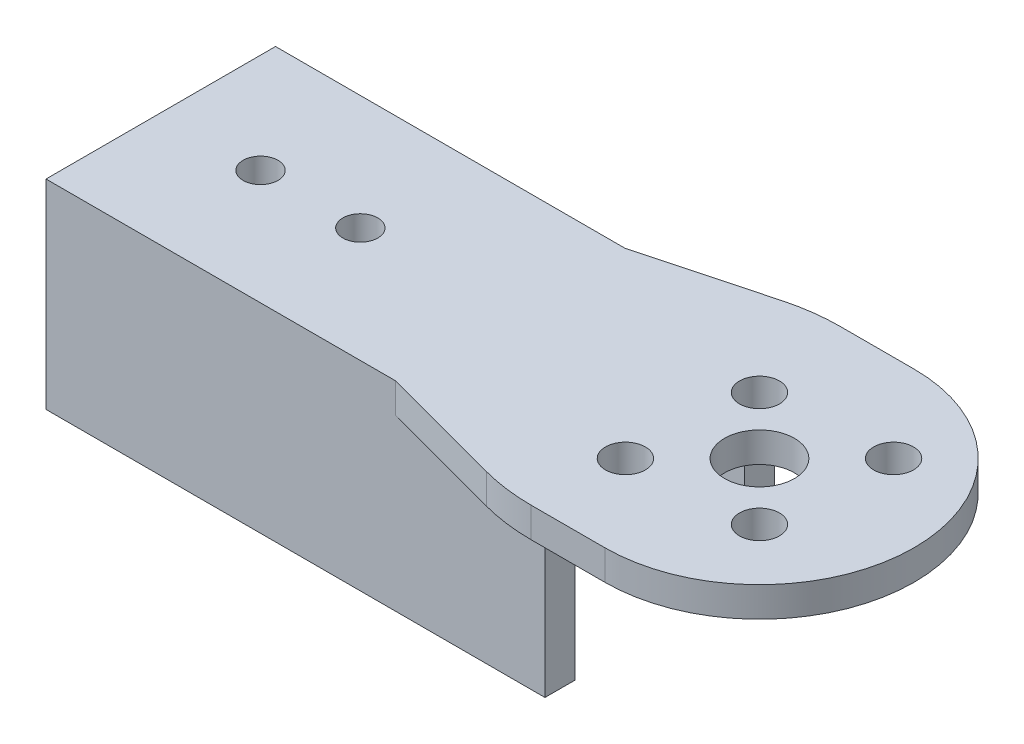
ISO-10303-21;
HEADER;
FILE_DESCRIPTION(('STEP AP214'),'2;1');
FILE_NAME('part.step','',(''),(''),'','','');
FILE_SCHEMA(('AUTOMOTIVE_DESIGN { 1 0 10303 214 1 1 1 1 }'));
ENDSEC;
DATA;
#1=APPLICATION_CONTEXT('core data for automotive mechanical design processes');
#2=APPLICATION_PROTOCOL_DEFINITION('international standard','automotive_design',2000,#1);
#3=PRODUCT_CONTEXT('',#1,'mechanical');
#4=PRODUCT('Part','Part','',(#3));
#5=PRODUCT_RELATED_PRODUCT_CATEGORY('part','',(#4));
#6=PRODUCT_DEFINITION_FORMATION('','',#4);
#7=PRODUCT_DEFINITION_CONTEXT('part definition',#1,'design');
#8=PRODUCT_DEFINITION('design','',#6,#7);
#9=PRODUCT_DEFINITION_SHAPE('','',#8);
#10=(LENGTH_UNIT() NAMED_UNIT(*) SI_UNIT(.MILLI.,.METRE.));
#11=(NAMED_UNIT(*) PLANE_ANGLE_UNIT() SI_UNIT($,.RADIAN.));
#12=(NAMED_UNIT(*) SI_UNIT($,.STERADIAN.) SOLID_ANGLE_UNIT());
#13=UNCERTAINTY_MEASURE_WITH_UNIT(LENGTH_MEASURE(1.E-05),#10,'distance_accuracy_value','');
#14=(GEOMETRIC_REPRESENTATION_CONTEXT(3) GLOBAL_UNCERTAINTY_ASSIGNED_CONTEXT((#13)) GLOBAL_UNIT_ASSIGNED_CONTEXT((#10,
#11,#12)) REPRESENTATION_CONTEXT('',''));
#15=CARTESIAN_POINT('',(0.,0.,0.));
#16=DIRECTION('',(0.,0.,1.));
#17=DIRECTION('',(1.,0.,0.));
#18=AXIS2_PLACEMENT_3D('',#15,#16,#17);
#19=CARTESIAN_POINT('',(25.,20.,-11.5));
#20=DIRECTION('',(-1.,0.,0.));
#21=DIRECTION('',(0.,0.,1.));
#22=AXIS2_PLACEMENT_3D('',#19,#20,#21);
#23=PLANE('',#22);
#24=DIRECTION('',(0.,-1.,0.));
#25=VECTOR('',#24,1.);
#26=CARTESIAN_POINT('',(25.,20.,-11.5));
#27=LINE('',#26,#25);
#28=CARTESIAN_POINT('',(25.,17.,-11.5));
#29=VERTEX_POINT('',#28);
#30=CARTESIAN_POINT('',(25.,0.,-11.5));
#31=VERTEX_POINT('',#30);
#32=EDGE_CURVE('E166',#29,#31,#27,.T.);
#33=ORIENTED_EDGE('',*,*,#32,.F.);
#34=DIRECTION('',(0.,0.,1.));
#35=VECTOR('',#34,1.);
#36=CARTESIAN_POINT('',(25.,17.,-11.5));
#37=LINE('',#36,#35);
#38=CARTESIAN_POINT('',(25.,17.,-8.5));
#39=VERTEX_POINT('',#38);
#40=EDGE_CURVE('E148',#29,#39,#37,.T.);
#41=ORIENTED_EDGE('',*,*,#40,.T.);
#42=DIRECTION('',(0.,1.,0.));
#43=VECTOR('',#42,1.);
#44=CARTESIAN_POINT('',(25.,0.,-8.5));
#45=LINE('',#44,#43);
#46=CARTESIAN_POINT('',(25.,0.,-8.5));
#47=VERTEX_POINT('',#46);
#48=EDGE_CURVE('E252',#47,#39,#45,.T.);
#49=ORIENTED_EDGE('',*,*,#48,.F.);
#50=DIRECTION('',(0.,0.,-1.));
#51=VECTOR('',#50,1.);
#52=CARTESIAN_POINT('',(25.,0.,-11.5));
#53=LINE('',#52,#51);
#54=EDGE_CURVE('E173',#47,#31,#53,.T.);
#55=ORIENTED_EDGE('',*,*,#54,.T.);
#56=EDGE_LOOP('',(#33,#41,#49,#55));
#57=FACE_BOUND('',#56,.T.);
#58=ADVANCED_FACE('F36',(#57),#23,.F.);
#59=CARTESIAN_POINT('',(0.,0.,0.));
#60=DIRECTION('',(0.,1.,0.));
#61=DIRECTION('',(0.,0.,1.));
#62=AXIS2_PLACEMENT_3D('',#59,#60,#61);
#63=PLANE('',#62);
#64=DIRECTION('',(0.,0.,1.));
#65=VECTOR('',#64,1.);
#66=CARTESIAN_POINT('',(-25.,0.,-11.5));
#67=LINE('',#66,#65);
#68=CARTESIAN_POINT('',(-25.,0.,8.5));
#69=VERTEX_POINT('',#68);
#70=CARTESIAN_POINT('',(-25.,0.,11.5));
#71=VERTEX_POINT('',#70);
#72=EDGE_CURVE('E283',#69,#71,#67,.T.);
#73=ORIENTED_EDGE('',*,*,#72,.F.);
#74=DIRECTION('',(1.,0.,0.));
#75=VECTOR('',#74,1.);
#76=CARTESIAN_POINT('',(-25.,0.,8.5));
#77=LINE('',#76,#75);
#78=CARTESIAN_POINT('',(25.,0.,8.5));
#79=VERTEX_POINT('',#78);
#80=EDGE_CURVE('E258',#69,#79,#77,.T.);
#81=ORIENTED_EDGE('',*,*,#80,.T.);
#82=CARTESIAN_POINT('',(25.,0.,11.5));
#83=VERTEX_POINT('',#82);
#84=EDGE_CURVE('E278',#83,#79,#53,.T.);
#85=ORIENTED_EDGE('',*,*,#84,.F.);
#86=DIRECTION('',(1.,0.,0.));
#87=VECTOR('',#86,1.);
#88=CARTESIAN_POINT('',(-25.,0.,11.5));
#89=LINE('',#88,#87);
#90=EDGE_CURVE('E272',#71,#83,#89,.T.);
#91=ORIENTED_EDGE('',*,*,#90,.F.);
#92=EDGE_LOOP('',(#73,#81,#85,#91));
#93=FACE_BOUND('',#92,.T.);
#94=ADVANCED_FACE('F302',(#93),#63,.F.);
#95=DIRECTION('',(0.,-1.,0.));
#96=VECTOR('',#95,1.);
#97=CARTESIAN_POINT('',(25.,0.,8.5));
#98=LINE('',#97,#96);
#99=CARTESIAN_POINT('',(25.,17.,8.5));
#100=VERTEX_POINT('',#99);
#101=EDGE_CURVE('E238',#100,#79,#98,.T.);
#102=ORIENTED_EDGE('',*,*,#101,.F.);
#103=CARTESIAN_POINT('',(25.,17.,11.5));
#104=VERTEX_POINT('',#103);
#105=EDGE_CURVE('E161',#100,#104,#37,.T.);
#106=ORIENTED_EDGE('',*,*,#105,.T.);
#107=DIRECTION('',(0.,-1.,0.));
#108=VECTOR('',#107,1.);
#109=CARTESIAN_POINT('',(25.,20.,11.5));
#110=LINE('',#109,#108);
#111=EDGE_CURVE('E277',#104,#83,#110,.T.);
#112=ORIENTED_EDGE('',*,*,#111,.T.);
#113=ORIENTED_EDGE('',*,*,#84,.T.);
#114=EDGE_LOOP('',(#102,#106,#112,#113));
#115=FACE_BOUND('',#114,.T.);
#116=ADVANCED_FACE('F305',(#115),#23,.F.);
#117=CARTESIAN_POINT('',(-25.,20.,-11.5));
#118=DIRECTION('',(0.,0.,1.));
#119=DIRECTION('',(1.,0.,0.));
#120=AXIS2_PLACEMENT_3D('',#117,#118,#119);
#121=PLANE('',#120);
#122=DIRECTION('',(-1.,0.,0.));
#123=VECTOR('',#122,1.);
#124=CARTESIAN_POINT('',(-25.,20.,-11.5));
#125=LINE('',#124,#123);
#126=CARTESIAN_POINT('',(10.,20.,-11.5));
#127=VERTEX_POINT('',#126);
#128=CARTESIAN_POINT('',(-25.,20.,-11.5));
#129=VERTEX_POINT('',#128);
#130=EDGE_CURVE('E269',#127,#129,#125,.T.);
#131=ORIENTED_EDGE('',*,*,#130,.F.);
#132=DIRECTION('',(0.,1.,0.));
#133=VECTOR('',#132,1.);
#134=CARTESIAN_POINT('',(10.,17.,-11.5));
#135=LINE('',#134,#133);
#136=CARTESIAN_POINT('',(10.,17.,-11.5));
#137=VERTEX_POINT('',#136);
#138=EDGE_CURVE('E169',#137,#127,#135,.T.);
#139=ORIENTED_EDGE('',*,*,#138,.F.);
#140=DIRECTION('',(1.,0.,0.));
#141=VECTOR('',#140,1.);
#142=CARTESIAN_POINT('',(10.,17.,-11.5));
#143=LINE('',#142,#141);
#144=EDGE_CURVE('E152',#137,#29,#143,.T.);
#145=ORIENTED_EDGE('',*,*,#144,.T.);
#146=ORIENTED_EDGE('',*,*,#32,.T.);
#147=DIRECTION('',(-1.,0.,0.));
#148=VECTOR('',#147,1.);
#149=CARTESIAN_POINT('',(-25.,0.,-11.5));
#150=LINE('',#149,#148);
#151=CARTESIAN_POINT('',(-25.,0.,-11.5));
#152=VERTEX_POINT('',#151);
#153=EDGE_CURVE('E281',#31,#152,#150,.T.);
#154=ORIENTED_EDGE('',*,*,#153,.T.);
#155=DIRECTION('',(0.,-1.,0.));
#156=VECTOR('',#155,1.);
#157=CARTESIAN_POINT('',(-25.,20.,-11.5));
#158=LINE('',#157,#156);
#159=EDGE_CURVE('E176',#129,#152,#158,.T.);
#160=ORIENTED_EDGE('',*,*,#159,.F.);
#161=EDGE_LOOP('',(#131,#139,#145,#146,#154,#160));
#162=FACE_BOUND('',#161,.T.);
#163=ADVANCED_FACE('F165',(#162),#121,.F.);
#164=CARTESIAN_POINT('',(-25.,20.,-11.5));
#165=DIRECTION('',(1.,0.,0.));
#166=DIRECTION('',(0.,0.,-1.));
#167=AXIS2_PLACEMENT_3D('',#164,#165,#166);
#168=PLANE('',#167);
#169=DIRECTION('',(0.,0.,1.));
#170=VECTOR('',#169,1.);
#171=CARTESIAN_POINT('',(-25.,17.,8.5));
#172=LINE('',#171,#170);
#173=CARTESIAN_POINT('',(-25.,17.,-8.5));
#174=VERTEX_POINT('',#173);
#175=CARTESIAN_POINT('',(-25.,17.,8.5));
#176=VERTEX_POINT('',#175);
#177=EDGE_CURVE('E255',#174,#176,#172,.T.);
#178=ORIENTED_EDGE('',*,*,#177,.T.);
#179=DIRECTION('',(0.,-1.,0.));
#180=VECTOR('',#179,1.);
#181=CARTESIAN_POINT('',(-25.,0.,8.5));
#182=LINE('',#181,#180);
#183=EDGE_CURVE('E248',#176,#69,#182,.T.);
#184=ORIENTED_EDGE('',*,*,#183,.T.);
#185=ORIENTED_EDGE('',*,*,#72,.T.);
#186=DIRECTION('',(0.,-1.,0.));
#187=VECTOR('',#186,1.);
#188=CARTESIAN_POINT('',(-25.,20.,11.5));
#189=LINE('',#188,#187);
#190=CARTESIAN_POINT('',(-25.,20.,11.5));
#191=VERTEX_POINT('',#190);
#192=EDGE_CURVE('E182',#191,#71,#189,.T.);
#193=ORIENTED_EDGE('',*,*,#192,.F.);
#194=DIRECTION('',(0.,0.,1.));
#195=VECTOR('',#194,1.);
#196=CARTESIAN_POINT('',(-25.,20.,-11.5));
#197=LINE('',#196,#195);
#198=EDGE_CURVE('E271',#129,#191,#197,.T.);
#199=ORIENTED_EDGE('',*,*,#198,.F.);
#200=ORIENTED_EDGE('',*,*,#159,.T.);
#201=CARTESIAN_POINT('',(-25.,0.,-8.5));
#202=VERTEX_POINT('',#201);
#203=EDGE_CURVE('E284',#152,#202,#67,.T.);
#204=ORIENTED_EDGE('',*,*,#203,.T.);
#205=DIRECTION('',(0.,1.,0.));
#206=VECTOR('',#205,1.);
#207=CARTESIAN_POINT('',(-25.,0.,-8.5));
#208=LINE('',#207,#206);
#209=EDGE_CURVE('E251',#202,#174,#208,.T.);
#210=ORIENTED_EDGE('',*,*,#209,.T.);
#211=EDGE_LOOP('',(#178,#184,#185,#193,#199,#200,#204,#210));
#212=FACE_BOUND('',#211,.T.);
#213=ADVANCED_FACE('F335',(#212),#168,.F.);
#214=CARTESIAN_POINT('',(-25.,20.,11.5));
#215=DIRECTION('',(0.,0.,-1.));
#216=DIRECTION('',(-1.,0.,0.));
#217=AXIS2_PLACEMENT_3D('',#214,#215,#216);
#218=PLANE('',#217);
#219=DIRECTION('',(-1.,0.,0.));
#220=VECTOR('',#219,1.);
#221=CARTESIAN_POINT('',(10.,17.,11.5));
#222=LINE('',#221,#220);
#223=CARTESIAN_POINT('',(10.,17.,11.5));
#224=VERTEX_POINT('',#223);
#225=EDGE_CURVE('E160',#104,#224,#222,.T.);
#226=ORIENTED_EDGE('',*,*,#225,.T.);
#227=DIRECTION('',(0.,1.,0.));
#228=VECTOR('',#227,1.);
#229=CARTESIAN_POINT('',(10.,17.,11.5));
#230=LINE('',#229,#228);
#231=CARTESIAN_POINT('',(10.,20.,11.5));
#232=VERTEX_POINT('',#231);
#233=EDGE_CURVE('E244',#224,#232,#230,.T.);
#234=ORIENTED_EDGE('',*,*,#233,.T.);
#235=DIRECTION('',(1.,0.,0.));
#236=VECTOR('',#235,1.);
#237=CARTESIAN_POINT('',(-25.,20.,11.5));
#238=LINE('',#237,#236);
#239=EDGE_CURVE('E274',#191,#232,#238,.T.);
#240=ORIENTED_EDGE('',*,*,#239,.F.);
#241=ORIENTED_EDGE('',*,*,#192,.T.);
#242=ORIENTED_EDGE('',*,*,#90,.T.);
#243=ORIENTED_EDGE('',*,*,#111,.F.);
#244=EDGE_LOOP('',(#226,#234,#240,#241,#242,#243));
#245=FACE_BOUND('',#244,.T.);
#246=ADVANCED_FACE('F295',(#245),#218,.F.);
#247=CARTESIAN_POINT('',(0.,20.,0.));
#248=DIRECTION('',(0.,1.,0.));
#249=DIRECTION('',(0.,0.,1.));
#250=AXIS2_PLACEMENT_3D('',#247,#248,#249);
#251=PLANE('',#250);
#252=CARTESIAN_POINT('',(-15.,20.,0.));
#253=DIRECTION('',(0.,1.,0.));
#254=DIRECTION('',(0.,0.,1.));
#255=AXIS2_PLACEMENT_3D('',#252,#253,#254);
#256=CIRCLE('',#255,1.75);
#257=CARTESIAN_POINT('',(-15.,20.,1.75));
#258=VERTEX_POINT('',#257);
#259=EDGE_CURVE('E190',#258,#258,#256,.T.);
#260=ORIENTED_EDGE('',*,*,#259,.F.);
#261=EDGE_LOOP('',(#260));
#262=FACE_BOUND('',#261,.T.);
#263=CARTESIAN_POINT('',(29.272435072389,20.,-5.72756492761104));
#264=DIRECTION('',(0.,1.,0.));
#265=DIRECTION('',(0.,0.,1.));
#266=AXIS2_PLACEMENT_3D('',#263,#264,#265);
#267=CIRCLE('',#266,2.00000000000001);
#268=CARTESIAN_POINT('',(29.272435072389,20.,-3.72756492761103));
#269=VERTEX_POINT('',#268);
#270=EDGE_CURVE('E382',#269,#269,#267,.T.);
#271=ORIENTED_EDGE('',*,*,#270,.F.);
#272=EDGE_LOOP('',(#271));
#273=FACE_BOUND('',#272,.T.);
#274=CARTESIAN_POINT('',(28.2824855787278,20.,6.71751442127216));
#275=DIRECTION('',(0.,1.,0.));
#276=DIRECTION('',(0.,0.,1.));
#277=AXIS2_PLACEMENT_3D('',#274,#275,#276);
#278=CIRCLE('',#277,2.);
#279=CARTESIAN_POINT('',(28.2824855787278,20.,8.71751442127216));
#280=VERTEX_POINT('',#279);
#281=EDGE_CURVE('E386',#280,#280,#278,.T.);
#282=ORIENTED_EDGE('',*,*,#281,.F.);
#283=EDGE_LOOP('',(#282));
#284=FACE_BOUND('',#283,.T.);
#285=CARTESIAN_POINT('',(41.7175144212722,20.,-6.71751442127217));
#286=DIRECTION('',(0.,1.,0.));
#287=DIRECTION('',(0.,0.,1.));
#288=AXIS2_PLACEMENT_3D('',#285,#286,#287);
#289=CIRCLE('',#288,2.);
#290=CARTESIAN_POINT('',(41.7175144212722,20.,-4.71751442127216));
#291=VERTEX_POINT('',#290);
#292=EDGE_CURVE('E390',#291,#291,#289,.T.);
#293=ORIENTED_EDGE('',*,*,#292,.F.);
#294=EDGE_LOOP('',(#293));
#295=FACE_BOUND('',#294,.T.);
#296=CARTESIAN_POINT('',(40.727564927611,20.,5.72756492761104));
#297=DIRECTION('',(0.,1.,0.));
#298=DIRECTION('',(0.,0.,1.));
#299=AXIS2_PLACEMENT_3D('',#296,#297,#298);
#300=CIRCLE('',#299,2.);
#301=CARTESIAN_POINT('',(40.727564927611,20.,7.72756492761104));
#302=VERTEX_POINT('',#301);
#303=EDGE_CURVE('E394',#302,#302,#300,.T.);
#304=ORIENTED_EDGE('',*,*,#303,.F.);
#305=EDGE_LOOP('',(#304));
#306=FACE_BOUND('',#305,.T.);
#307=CARTESIAN_POINT('',(35.,20.,0.));
#308=DIRECTION('',(0.,1.,0.));
#309=DIRECTION('',(0.,0.,1.));
#310=AXIS2_PLACEMENT_3D('',#307,#308,#309);
#311=CIRCLE('',#310,3.5);
#312=CARTESIAN_POINT('',(35.,20.,3.5));
#313=VERTEX_POINT('',#312);
#314=EDGE_CURVE('E398',#313,#313,#311,.T.);
#315=ORIENTED_EDGE('',*,*,#314,.F.);
#316=EDGE_LOOP('',(#315));
#317=FACE_BOUND('',#316,.T.);
#318=CARTESIAN_POINT('',(-5.,20.,0.));
#319=DIRECTION('',(0.,1.,0.));
#320=DIRECTION('',(0.,0.,1.));
#321=AXIS2_PLACEMENT_3D('',#318,#319,#320);
#322=CIRCLE('',#321,1.75);
#323=CARTESIAN_POINT('',(-5.,20.,1.75));
#324=VERTEX_POINT('',#323);
#325=EDGE_CURVE('E401',#324,#324,#322,.T.);
#326=ORIENTED_EDGE('',*,*,#325,.F.);
#327=EDGE_LOOP('',(#326));
#328=FACE_BOUND('',#327,.T.);
#329=DIRECTION('',(0.966234939601246,0.,0.257662650560332));
#330=VECTOR('',#329,1.);
#331=CARTESIAN_POINT('',(25.,20.,15.5));
#332=LINE('',#331,#330);
#333=CARTESIAN_POINT('',(22.4676204700935,20.,14.8246987920249));
#334=VERTEX_POINT('',#333);
#335=EDGE_CURVE('E207',#232,#334,#332,.T.);
#336=ORIENTED_EDGE('',*,*,#335,.T.);
#337=CARTESIAN_POINT('',(27.6208734813001,20.,-4.5));
#338=DIRECTION('',(0.,1.,0.));
#339=DIRECTION('',(0.,0.,1.));
#340=AXIS2_PLACEMENT_3D('',#337,#338,#339);
#341=CIRCLE('',#340,20.);
#342=CARTESIAN_POINT('',(27.6208734813001,20.,15.5));
#343=VERTEX_POINT('',#342);
#344=EDGE_CURVE('E210',#334,#343,#341,.T.);
#345=ORIENTED_EDGE('',*,*,#344,.T.);
#346=DIRECTION('',(1.,0.,0.));
#347=VECTOR('',#346,1.);
#348=CARTESIAN_POINT('',(25.,20.,15.5));
#349=LINE('',#348,#347);
#350=CARTESIAN_POINT('',(35.,20.,15.5));
#351=VERTEX_POINT('',#350);
#352=EDGE_CURVE('E233',#343,#351,#349,.T.);
#353=ORIENTED_EDGE('',*,*,#352,.T.);
#354=CARTESIAN_POINT('',(35.,20.,0.));
#355=DIRECTION('',(0.,1.,0.));
#356=DIRECTION('',(0.,0.,-1.));
#357=AXIS2_PLACEMENT_3D('',#354,#355,#356);
#358=CIRCLE('',#357,15.5);
#359=CARTESIAN_POINT('',(35.,20.,-15.5));
#360=VERTEX_POINT('',#359);
#361=EDGE_CURVE('E230',#351,#360,#358,.T.);
#362=ORIENTED_EDGE('',*,*,#361,.T.);
#363=DIRECTION('',(-1.,0.,0.));
#364=VECTOR('',#363,1.);
#365=CARTESIAN_POINT('',(25.,20.,-15.5));
#366=LINE('',#365,#364);
#367=CARTESIAN_POINT('',(27.6208734813001,20.,-15.5));
#368=VERTEX_POINT('',#367);
#369=EDGE_CURVE('E222',#360,#368,#366,.T.);
#370=ORIENTED_EDGE('',*,*,#369,.T.);
#371=CARTESIAN_POINT('',(27.6208734813001,20.,4.5));
#372=DIRECTION('',(0.,1.,0.));
#373=DIRECTION('',(0.,0.,1.));
#374=AXIS2_PLACEMENT_3D('',#371,#372,#373);
#375=CIRCLE('',#374,20.);
#376=CARTESIAN_POINT('',(22.4676204700935,20.,-14.8246987920249));
#377=VERTEX_POINT('',#376);
#378=EDGE_CURVE('E179',#368,#377,#375,.T.);
#379=ORIENTED_EDGE('',*,*,#378,.T.);
#380=DIRECTION('',(-0.966234939601246,0.,0.257662650560332));
#381=VECTOR('',#380,1.);
#382=CARTESIAN_POINT('',(25.,20.,-15.5));
#383=LINE('',#382,#381);
#384=EDGE_CURVE('E170',#377,#127,#383,.T.);
#385=ORIENTED_EDGE('',*,*,#384,.T.);
#386=ORIENTED_EDGE('',*,*,#130,.T.);
#387=ORIENTED_EDGE('',*,*,#198,.T.);
#388=ORIENTED_EDGE('',*,*,#239,.T.);
#389=EDGE_LOOP('',(#336,#345,#353,#362,#370,#379,#385,#386,#387,#388));
#390=FACE_BOUND('',#389,.T.);
#391=ADVANCED_FACE('F228',(#262,#273,#284,#295,#306,#317,#328,#390),#251,.T.);
#392=ORIENTED_EDGE('',*,*,#54,.F.);
#393=DIRECTION('',(1.,0.,0.));
#394=VECTOR('',#393,1.);
#395=CARTESIAN_POINT('',(-25.,0.,-8.5));
#396=LINE('',#395,#394);
#397=EDGE_CURVE('E265',#202,#47,#396,.T.);
#398=ORIENTED_EDGE('',*,*,#397,.F.);
#399=ORIENTED_EDGE('',*,*,#203,.F.);
#400=ORIENTED_EDGE('',*,*,#153,.F.);
#401=EDGE_LOOP('',(#392,#398,#399,#400));
#402=FACE_BOUND('',#401,.T.);
#403=ADVANCED_FACE('F339',(#402),#63,.F.);
#404=CARTESIAN_POINT('',(-25.,0.,8.5));
#405=DIRECTION('',(0.,0.,1.));
#406=DIRECTION('',(1.,0.,0.));
#407=AXIS2_PLACEMENT_3D('',#404,#405,#406);
#408=PLANE('',#407);
#409=ORIENTED_EDGE('',*,*,#101,.T.);
#410=ORIENTED_EDGE('',*,*,#80,.F.);
#411=ORIENTED_EDGE('',*,*,#183,.F.);
#412=DIRECTION('',(1.,0.,0.));
#413=VECTOR('',#412,1.);
#414=CARTESIAN_POINT('',(-25.,17.,8.5));
#415=LINE('',#414,#413);
#416=EDGE_CURVE('E261',#176,#100,#415,.T.);
#417=ORIENTED_EDGE('',*,*,#416,.T.);
#418=EDGE_LOOP('',(#409,#410,#411,#417));
#419=FACE_BOUND('',#418,.T.);
#420=ADVANCED_FACE('F344',(#419),#408,.F.);
#421=CARTESIAN_POINT('',(-25.,17.,8.5));
#422=DIRECTION('',(0.,1.,0.));
#423=DIRECTION('',(0.,0.,1.));
#424=AXIS2_PLACEMENT_3D('',#421,#422,#423);
#425=PLANE('',#424);
#426=CARTESIAN_POINT('',(-15.,17.,0.));
#427=DIRECTION('',(0.,1.,0.));
#428=DIRECTION('',(0.,0.,1.));
#429=AXIS2_PLACEMENT_3D('',#426,#427,#428);
#430=CIRCLE('',#429,1.75);
#431=CARTESIAN_POINT('',(-15.,17.,1.75));
#432=VERTEX_POINT('',#431);
#433=EDGE_CURVE('E205',#432,#432,#430,.T.);
#434=ORIENTED_EDGE('',*,*,#433,.T.);
#435=EDGE_LOOP('',(#434));
#436=FACE_BOUND('',#435,.T.);
#437=CARTESIAN_POINT('',(29.272435072389,17.,-5.72756492761104));
#438=DIRECTION('',(0.,1.,0.));
#439=DIRECTION('',(0.,0.,1.));
#440=AXIS2_PLACEMENT_3D('',#437,#438,#439);
#441=CIRCLE('',#440,2.00000000000001);
#442=CARTESIAN_POINT('',(29.272435072389,17.,-3.72756492761103));
#443=VERTEX_POINT('',#442);
#444=EDGE_CURVE('E202',#443,#443,#441,.T.);
#445=ORIENTED_EDGE('',*,*,#444,.T.);
#446=EDGE_LOOP('',(#445));
#447=FACE_BOUND('',#446,.T.);
#448=CARTESIAN_POINT('',(28.2824855787278,17.,6.71751442127216));
#449=DIRECTION('',(0.,1.,0.));
#450=DIRECTION('',(0.,0.,1.));
#451=AXIS2_PLACEMENT_3D('',#448,#449,#450);
#452=CIRCLE('',#451,2.);
#453=CARTESIAN_POINT('',(28.2824855787278,17.,8.71751442127216));
#454=VERTEX_POINT('',#453);
#455=EDGE_CURVE('E199',#454,#454,#452,.T.);
#456=ORIENTED_EDGE('',*,*,#455,.T.);
#457=EDGE_LOOP('',(#456));
#458=FACE_BOUND('',#457,.T.);
#459=CARTESIAN_POINT('',(41.7175144212722,17.,-6.71751442127217));
#460=DIRECTION('',(0.,1.,0.));
#461=DIRECTION('',(0.,0.,1.));
#462=AXIS2_PLACEMENT_3D('',#459,#460,#461);
#463=CIRCLE('',#462,2.);
#464=CARTESIAN_POINT('',(41.7175144212722,17.,-4.71751442127216));
#465=VERTEX_POINT('',#464);
#466=EDGE_CURVE('E196',#465,#465,#463,.T.);
#467=ORIENTED_EDGE('',*,*,#466,.T.);
#468=EDGE_LOOP('',(#467));
#469=FACE_BOUND('',#468,.T.);
#470=CARTESIAN_POINT('',(40.727564927611,17.,5.72756492761104));
#471=DIRECTION('',(0.,1.,0.));
#472=DIRECTION('',(0.,0.,1.));
#473=AXIS2_PLACEMENT_3D('',#470,#471,#472);
#474=CIRCLE('',#473,2.);
#475=CARTESIAN_POINT('',(40.727564927611,17.,7.72756492761104));
#476=VERTEX_POINT('',#475);
#477=EDGE_CURVE('E193',#476,#476,#474,.T.);
#478=ORIENTED_EDGE('',*,*,#477,.T.);
#479=EDGE_LOOP('',(#478));
#480=FACE_BOUND('',#479,.T.);
#481=CARTESIAN_POINT('',(35.,17.,0.));
#482=DIRECTION('',(0.,1.,0.));
#483=DIRECTION('',(0.,0.,1.));
#484=AXIS2_PLACEMENT_3D('',#481,#482,#483);
#485=CIRCLE('',#484,3.5);
#486=CARTESIAN_POINT('',(35.,17.,3.5));
#487=VERTEX_POINT('',#486);
#488=EDGE_CURVE('E189',#487,#487,#485,.T.);
#489=ORIENTED_EDGE('',*,*,#488,.T.);
#490=EDGE_LOOP('',(#489));
#491=FACE_BOUND('',#490,.T.);
#492=CARTESIAN_POINT('',(-5.,17.,0.));
#493=DIRECTION('',(0.,1.,0.));
#494=DIRECTION('',(0.,0.,1.));
#495=AXIS2_PLACEMENT_3D('',#492,#493,#494);
#496=CIRCLE('',#495,1.75);
#497=CARTESIAN_POINT('',(-5.,17.,1.75));
#498=VERTEX_POINT('',#497);
#499=EDGE_CURVE('E186',#498,#498,#496,.T.);
#500=ORIENTED_EDGE('',*,*,#499,.T.);
#501=EDGE_LOOP('',(#500));
#502=FACE_BOUND('',#501,.T.);
#503=DIRECTION('',(1.,0.,0.));
#504=VECTOR('',#503,1.);
#505=CARTESIAN_POINT('',(25.,17.,15.5));
#506=LINE('',#505,#504);
#507=CARTESIAN_POINT('',(27.6208734813001,17.,15.5));
#508=VERTEX_POINT('',#507);
#509=CARTESIAN_POINT('',(35.,17.,15.5));
#510=VERTEX_POINT('',#509);
#511=EDGE_CURVE('E311',#508,#510,#506,.T.);
#512=ORIENTED_EDGE('',*,*,#511,.F.);
#513=CARTESIAN_POINT('',(27.6208734813001,17.,-4.5));
#514=DIRECTION('',(0.,1.,0.));
#515=DIRECTION('',(0.,0.,1.));
#516=AXIS2_PLACEMENT_3D('',#513,#514,#515);
#517=CIRCLE('',#516,20.);
#518=CARTESIAN_POINT('',(22.4676204700935,17.,14.8246987920249));
#519=VERTEX_POINT('',#518);
#520=EDGE_CURVE('E215',#508,#519,#517,.F.);
#521=ORIENTED_EDGE('',*,*,#520,.T.);
#522=DIRECTION('',(0.966234939601246,0.,0.257662650560332));
#523=VECTOR('',#522,1.);
#524=CARTESIAN_POINT('',(25.,17.,15.5));
#525=LINE('',#524,#523);
#526=EDGE_CURVE('E308',#224,#519,#525,.T.);
#527=ORIENTED_EDGE('',*,*,#526,.F.);
#528=ORIENTED_EDGE('',*,*,#225,.F.);
#529=ORIENTED_EDGE('',*,*,#105,.F.);
#530=ORIENTED_EDGE('',*,*,#416,.F.);
#531=ORIENTED_EDGE('',*,*,#177,.F.);
#532=DIRECTION('',(1.,0.,0.));
#533=VECTOR('',#532,1.);
#534=CARTESIAN_POINT('',(-25.,17.,-8.5));
#535=LINE('',#534,#533);
#536=EDGE_CURVE('E155',#174,#39,#535,.T.);
#537=ORIENTED_EDGE('',*,*,#536,.T.);
#538=ORIENTED_EDGE('',*,*,#40,.F.);
#539=ORIENTED_EDGE('',*,*,#144,.F.);
#540=DIRECTION('',(-0.966234939601246,0.,0.257662650560332));
#541=VECTOR('',#540,1.);
#542=CARTESIAN_POINT('',(25.,17.,-15.5));
#543=LINE('',#542,#541);
#544=CARTESIAN_POINT('',(22.4676204700935,17.,-14.8246987920249));
#545=VERTEX_POINT('',#544);
#546=EDGE_CURVE('E247',#545,#137,#543,.T.);
#547=ORIENTED_EDGE('',*,*,#546,.F.);
#548=CARTESIAN_POINT('',(27.6208734813001,17.,4.5));
#549=DIRECTION('',(0.,1.,0.));
#550=DIRECTION('',(0.,0.,1.));
#551=AXIS2_PLACEMENT_3D('',#548,#549,#550);
#552=CIRCLE('',#551,20.);
#553=CARTESIAN_POINT('',(27.6208734813001,17.,-15.5));
#554=VERTEX_POINT('',#553);
#555=EDGE_CURVE('E51',#545,#554,#552,.F.);
#556=ORIENTED_EDGE('',*,*,#555,.T.);
#557=DIRECTION('',(-1.,0.,0.));
#558=VECTOR('',#557,1.);
#559=CARTESIAN_POINT('',(25.,17.,-15.5));
#560=LINE('',#559,#558);
#561=CARTESIAN_POINT('',(35.,17.,-15.5));
#562=VERTEX_POINT('',#561);
#563=EDGE_CURVE('E224',#562,#554,#560,.T.);
#564=ORIENTED_EDGE('',*,*,#563,.F.);
#565=CARTESIAN_POINT('',(35.,17.,0.));
#566=DIRECTION('',(0.,1.,0.));
#567=DIRECTION('',(0.,0.,-1.));
#568=AXIS2_PLACEMENT_3D('',#565,#566,#567);
#569=CIRCLE('',#568,15.5);
#570=EDGE_CURVE('E315',#510,#562,#569,.T.);
#571=ORIENTED_EDGE('',*,*,#570,.F.);
#572=EDGE_LOOP('',(#512,#521,#527,#528,#529,#530,#531,#537,#538,#539,#547,#556,#564,#571));
#573=FACE_BOUND('',#572,.T.);
#574=ADVANCED_FACE('F151',(#436,#447,#458,#469,#480,#491,#502,#573),#425,.F.);
#575=CARTESIAN_POINT('',(-25.,0.,-8.5));
#576=DIRECTION('',(0.,0.,-1.));
#577=DIRECTION('',(-1.,0.,0.));
#578=AXIS2_PLACEMENT_3D('',#575,#576,#577);
#579=PLANE('',#578);
#580=ORIENTED_EDGE('',*,*,#48,.T.);
#581=ORIENTED_EDGE('',*,*,#536,.F.);
#582=ORIENTED_EDGE('',*,*,#209,.F.);
#583=ORIENTED_EDGE('',*,*,#397,.T.);
#584=EDGE_LOOP('',(#580,#581,#582,#583));
#585=FACE_BOUND('',#584,.T.);
#586=ADVANCED_FACE('F341',(#585),#579,.F.);
#587=CARTESIAN_POINT('',(25.,17.,-15.5));
#588=DIRECTION('',(-0.257662650560332,0.,-0.966234939601246));
#589=DIRECTION('',(-0.966234939601246,0.,0.257662650560332));
#590=AXIS2_PLACEMENT_3D('',#587,#588,#589);
#591=PLANE('',#590);
#592=ORIENTED_EDGE('',*,*,#384,.F.);
#593=DIRECTION('',(0.,1.,0.));
#594=VECTOR('',#593,1.);
#595=CARTESIAN_POINT('',(22.4676204700935,17.,-14.8246987920249));
#596=LINE('',#595,#594);
#597=EDGE_CURVE('E11',#377,#545,#596,.F.);
#598=ORIENTED_EDGE('',*,*,#597,.T.);
#599=ORIENTED_EDGE('',*,*,#546,.T.);
#600=ORIENTED_EDGE('',*,*,#138,.T.);
#601=EDGE_LOOP('',(#592,#598,#599,#600));
#602=FACE_BOUND('',#601,.T.);
#603=ADVANCED_FACE('F452',(#602),#591,.T.);
#604=CARTESIAN_POINT('',(25.,17.,-15.5));
#605=DIRECTION('',(0.,0.,-1.));
#606=DIRECTION('',(-1.,0.,0.));
#607=AXIS2_PLACEMENT_3D('',#604,#605,#606);
#608=PLANE('',#607);
#609=ORIENTED_EDGE('',*,*,#563,.T.);
#610=DIRECTION('',(0.,1.,0.));
#611=VECTOR('',#610,1.);
#612=CARTESIAN_POINT('',(27.6208734813001,17.,-15.5));
#613=LINE('',#612,#611);
#614=EDGE_CURVE('E44',#554,#368,#613,.T.);
#615=ORIENTED_EDGE('',*,*,#614,.T.);
#616=ORIENTED_EDGE('',*,*,#369,.F.);
#617=DIRECTION('',(0.,1.,0.));
#618=VECTOR('',#617,1.);
#619=CARTESIAN_POINT('',(35.,17.,-15.5));
#620=LINE('',#619,#618);
#621=EDGE_CURVE('E239',#562,#360,#620,.T.);
#622=ORIENTED_EDGE('',*,*,#621,.F.);
#623=EDGE_LOOP('',(#609,#615,#616,#622));
#624=FACE_BOUND('',#623,.T.);
#625=ADVANCED_FACE('F221',(#624),#608,.T.);
#626=CARTESIAN_POINT('',(35.,17.,0.));
#627=DIRECTION('',(0.,1.,0.));
#628=DIRECTION('',(0.,0.,1.));
#629=AXIS2_PLACEMENT_3D('',#626,#627,#628);
#630=CYLINDRICAL_SURFACE('',#629,15.5);
#631=ORIENTED_EDGE('',*,*,#361,.F.);
#632=DIRECTION('',(0.,1.,0.));
#633=VECTOR('',#632,1.);
#634=CARTESIAN_POINT('',(35.,17.,15.5));
#635=LINE('',#634,#633);
#636=EDGE_CURVE('E241',#510,#351,#635,.T.);
#637=ORIENTED_EDGE('',*,*,#636,.F.);
#638=ORIENTED_EDGE('',*,*,#570,.T.);
#639=ORIENTED_EDGE('',*,*,#621,.T.);
#640=EDGE_LOOP('',(#631,#637,#638,#639));
#641=FACE_BOUND('',#640,.T.);
#642=ADVANCED_FACE('F327',(#641),#630,.T.);
#643=CARTESIAN_POINT('',(25.,17.,15.5));
#644=DIRECTION('',(0.,0.,1.));
#645=DIRECTION('',(1.,0.,0.));
#646=AXIS2_PLACEMENT_3D('',#643,#644,#645);
#647=PLANE('',#646);
#648=ORIENTED_EDGE('',*,*,#352,.F.);
#649=DIRECTION('',(0.,1.,0.));
#650=VECTOR('',#649,1.);
#651=CARTESIAN_POINT('',(27.6208734813001,17.,15.5));
#652=LINE('',#651,#650);
#653=EDGE_CURVE('E212',#343,#508,#652,.F.);
#654=ORIENTED_EDGE('',*,*,#653,.T.);
#655=ORIENTED_EDGE('',*,*,#511,.T.);
#656=ORIENTED_EDGE('',*,*,#636,.T.);
#657=EDGE_LOOP('',(#648,#654,#655,#656));
#658=FACE_BOUND('',#657,.T.);
#659=ADVANCED_FACE('F324',(#658),#647,.T.);
#660=CARTESIAN_POINT('',(25.,17.,15.5));
#661=DIRECTION('',(-0.257662650560332,0.,0.966234939601246));
#662=DIRECTION('',(0.966234939601246,0.,0.257662650560332));
#663=AXIS2_PLACEMENT_3D('',#660,#661,#662);
#664=PLANE('',#663);
#665=ORIENTED_EDGE('',*,*,#526,.T.);
#666=DIRECTION('',(0.,1.,0.));
#667=VECTOR('',#666,1.);
#668=CARTESIAN_POINT('',(22.4676204700935,17.,14.8246987920249));
#669=LINE('',#668,#667);
#670=EDGE_CURVE('E175',#519,#334,#669,.T.);
#671=ORIENTED_EDGE('',*,*,#670,.T.);
#672=ORIENTED_EDGE('',*,*,#335,.F.);
#673=ORIENTED_EDGE('',*,*,#233,.F.);
#674=EDGE_LOOP('',(#665,#671,#672,#673));
#675=FACE_BOUND('',#674,.T.);
#676=ADVANCED_FACE('F333',(#675),#664,.T.);
#677=CARTESIAN_POINT('',(-5.,0.,0.));
#678=DIRECTION('',(0.,1.,0.));
#679=DIRECTION('',(0.,0.,1.));
#680=AXIS2_PLACEMENT_3D('',#677,#678,#679);
#681=CYLINDRICAL_SURFACE('',#680,1.75);
#682=ORIENTED_EDGE('',*,*,#325,.T.);
#683=EDGE_LOOP('',(#682));
#684=FACE_BOUND('',#683,.T.);
#685=ORIENTED_EDGE('',*,*,#499,.F.);
#686=EDGE_LOOP('',(#685));
#687=FACE_BOUND('',#686,.T.);
#688=ADVANCED_FACE('F432',(#684,#687),#681,.F.);
#689=CARTESIAN_POINT('',(35.,0.,0.));
#690=DIRECTION('',(0.,1.,0.));
#691=DIRECTION('',(0.,0.,1.));
#692=AXIS2_PLACEMENT_3D('',#689,#690,#691);
#693=CYLINDRICAL_SURFACE('',#692,3.5);
#694=ORIENTED_EDGE('',*,*,#314,.T.);
#695=EDGE_LOOP('',(#694));
#696=FACE_BOUND('',#695,.T.);
#697=ORIENTED_EDGE('',*,*,#488,.F.);
#698=EDGE_LOOP('',(#697));
#699=FACE_BOUND('',#698,.T.);
#700=ADVANCED_FACE('F434',(#696,#699),#693,.F.);
#701=CARTESIAN_POINT('',(40.727564927611,0.,5.72756492761104));
#702=DIRECTION('',(0.,1.,0.));
#703=DIRECTION('',(0.,0.,1.));
#704=AXIS2_PLACEMENT_3D('',#701,#702,#703);
#705=CYLINDRICAL_SURFACE('',#704,2.);
#706=ORIENTED_EDGE('',*,*,#303,.T.);
#707=EDGE_LOOP('',(#706));
#708=FACE_BOUND('',#707,.T.);
#709=ORIENTED_EDGE('',*,*,#477,.F.);
#710=EDGE_LOOP('',(#709));
#711=FACE_BOUND('',#710,.T.);
#712=ADVANCED_FACE('F440',(#708,#711),#705,.F.);
#713=CARTESIAN_POINT('',(41.7175144212722,0.,-6.71751442127217));
#714=DIRECTION('',(0.,1.,0.));
#715=DIRECTION('',(0.,0.,1.));
#716=AXIS2_PLACEMENT_3D('',#713,#714,#715);
#717=CYLINDRICAL_SURFACE('',#716,2.);
#718=ORIENTED_EDGE('',*,*,#292,.T.);
#719=EDGE_LOOP('',(#718));
#720=FACE_BOUND('',#719,.T.);
#721=ORIENTED_EDGE('',*,*,#466,.F.);
#722=EDGE_LOOP('',(#721));
#723=FACE_BOUND('',#722,.T.);
#724=ADVANCED_FACE('F448',(#720,#723),#717,.F.);
#725=CARTESIAN_POINT('',(28.2824855787278,0.,6.71751442127216));
#726=DIRECTION('',(0.,1.,0.));
#727=DIRECTION('',(0.,0.,1.));
#728=AXIS2_PLACEMENT_3D('',#725,#726,#727);
#729=CYLINDRICAL_SURFACE('',#728,2.);
#730=ORIENTED_EDGE('',*,*,#281,.T.);
#731=EDGE_LOOP('',(#730));
#732=FACE_BOUND('',#731,.T.);
#733=ORIENTED_EDGE('',*,*,#455,.F.);
#734=EDGE_LOOP('',(#733));
#735=FACE_BOUND('',#734,.T.);
#736=ADVANCED_FACE('F417',(#732,#735),#729,.F.);
#737=CARTESIAN_POINT('',(29.272435072389,0.,-5.72756492761104));
#738=DIRECTION('',(0.,1.,0.));
#739=DIRECTION('',(0.,0.,1.));
#740=AXIS2_PLACEMENT_3D('',#737,#738,#739);
#741=CYLINDRICAL_SURFACE('',#740,2.00000000000001);
#742=ORIENTED_EDGE('',*,*,#270,.T.);
#743=EDGE_LOOP('',(#742));
#744=FACE_BOUND('',#743,.T.);
#745=ORIENTED_EDGE('',*,*,#444,.F.);
#746=EDGE_LOOP('',(#745));
#747=FACE_BOUND('',#746,.T.);
#748=ADVANCED_FACE('F413',(#744,#747),#741,.F.);
#749=CARTESIAN_POINT('',(-15.,0.,0.));
#750=DIRECTION('',(0.,1.,0.));
#751=DIRECTION('',(0.,0.,1.));
#752=AXIS2_PLACEMENT_3D('',#749,#750,#751);
#753=CYLINDRICAL_SURFACE('',#752,1.75);
#754=ORIENTED_EDGE('',*,*,#259,.T.);
#755=EDGE_LOOP('',(#754));
#756=FACE_BOUND('',#755,.T.);
#757=ORIENTED_EDGE('',*,*,#433,.F.);
#758=EDGE_LOOP('',(#757));
#759=FACE_BOUND('',#758,.T.);
#760=ADVANCED_FACE('F416',(#756,#759),#753,.F.);
#761=CARTESIAN_POINT('',(27.6208734813001,17.,-4.5));
#762=DIRECTION('',(0.,1.,0.));
#763=DIRECTION('',(0.,0.,1.));
#764=AXIS2_PLACEMENT_3D('',#761,#762,#763);
#765=CYLINDRICAL_SURFACE('',#764,20.);
#766=ORIENTED_EDGE('',*,*,#520,.F.);
#767=ORIENTED_EDGE('',*,*,#653,.F.);
#768=ORIENTED_EDGE('',*,*,#344,.F.);
#769=ORIENTED_EDGE('',*,*,#670,.F.);
#770=EDGE_LOOP('',(#766,#767,#768,#769));
#771=FACE_BOUND('',#770,.T.);
#772=ADVANCED_FACE('F331',(#771),#765,.T.);
#773=CARTESIAN_POINT('',(27.6208734813001,17.,4.5));
#774=DIRECTION('',(0.,1.,0.));
#775=DIRECTION('',(0.,0.,1.));
#776=AXIS2_PLACEMENT_3D('',#773,#774,#775);
#777=CYLINDRICAL_SURFACE('',#776,20.);
#778=ORIENTED_EDGE('',*,*,#555,.F.);
#779=ORIENTED_EDGE('',*,*,#597,.F.);
#780=ORIENTED_EDGE('',*,*,#378,.F.);
#781=ORIENTED_EDGE('',*,*,#614,.F.);
#782=EDGE_LOOP('',(#778,#779,#780,#781));
#783=FACE_BOUND('',#782,.T.);
#784=ADVANCED_FACE('F38',(#783),#777,.T.);
#785=CLOSED_SHELL('',(#58,#94,#116,#163,#213,#246,#391,#403,#420,#574,#586,#603,#625,#642,#659,
#676,#688,#700,#712,#724,#736,#748,#760,#772,#784));
#786=MANIFOLD_SOLID_BREP('B2',#785);
#787=ADVANCED_BREP_SHAPE_REPRESENTATION('',(#18,#786),#14);
#788=SHAPE_DEFINITION_REPRESENTATION(#9,#787);
ENDSEC;
END-ISO-10303-21;
